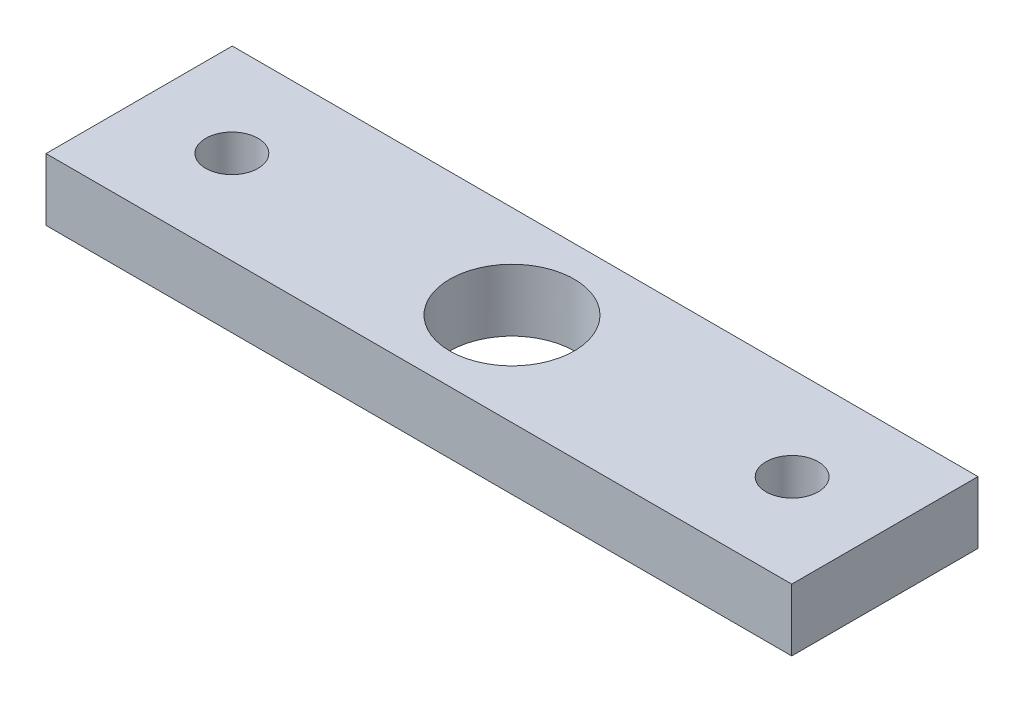
ISO-10303-21;
HEADER;
FILE_DESCRIPTION(('STEP AP214'),'2;1');
FILE_NAME('part.step','',(''),(''),'','','');
FILE_SCHEMA(('AUTOMOTIVE_DESIGN { 1 0 10303 214 1 1 1 1 }'));
ENDSEC;
DATA;
#1=APPLICATION_CONTEXT('core data for automotive mechanical design processes');
#2=APPLICATION_PROTOCOL_DEFINITION('international standard','automotive_design',2000,#1);
#3=PRODUCT_CONTEXT('',#1,'mechanical');
#4=PRODUCT('Part','Part','',(#3));
#5=PRODUCT_RELATED_PRODUCT_CATEGORY('part','',(#4));
#6=PRODUCT_DEFINITION_FORMATION('','',#4);
#7=PRODUCT_DEFINITION_CONTEXT('part definition',#1,'design');
#8=PRODUCT_DEFINITION('design','',#6,#7);
#9=PRODUCT_DEFINITION_SHAPE('','',#8);
#10=(LENGTH_UNIT() NAMED_UNIT(*) SI_UNIT(.MILLI.,.METRE.));
#11=(NAMED_UNIT(*) PLANE_ANGLE_UNIT() SI_UNIT($,.RADIAN.));
#12=(NAMED_UNIT(*) SI_UNIT($,.STERADIAN.) SOLID_ANGLE_UNIT());
#13=UNCERTAINTY_MEASURE_WITH_UNIT(LENGTH_MEASURE(1.E-05),#10,'distance_accuracy_value','');
#14=(GEOMETRIC_REPRESENTATION_CONTEXT(3) GLOBAL_UNCERTAINTY_ASSIGNED_CONTEXT((#13)) GLOBAL_UNIT_ASSIGNED_CONTEXT((#10,
#11,#12)) REPRESENTATION_CONTEXT('',''));
#15=CARTESIAN_POINT('',(0.,0.,0.));
#16=DIRECTION('',(0.,0.,1.));
#17=DIRECTION('',(1.,0.,0.));
#18=AXIS2_PLACEMENT_3D('',#15,#16,#17);
#19=CARTESIAN_POINT('',(38.0365,6.35,9.49999999999999));
#20=DIRECTION('',(-1.,0.,0.));
#21=DIRECTION('',(0.,0.,1.));
#22=AXIS2_PLACEMENT_3D('',#19,#20,#21);
#23=PLANE('',#22);
#24=DIRECTION('',(0.,0.,-1.));
#25=VECTOR('',#24,1.);
#26=CARTESIAN_POINT('',(38.0365,0.,9.49999999999999));
#27=LINE('',#26,#25);
#28=CARTESIAN_POINT('',(38.0365,0.,9.49999999999999));
#29=VERTEX_POINT('',#28);
#30=CARTESIAN_POINT('',(38.0365,0.,-9.50000000000001));
#31=VERTEX_POINT('',#30);
#32=EDGE_CURVE('E95',#29,#31,#27,.T.);
#33=ORIENTED_EDGE('',*,*,#32,.T.);
#34=DIRECTION('',(0.,-1.,0.));
#35=VECTOR('',#34,1.);
#36=CARTESIAN_POINT('',(38.0365,6.35,-9.50000000000001));
#37=LINE('',#36,#35);
#38=CARTESIAN_POINT('',(38.0365,6.35,-9.50000000000001));
#39=VERTEX_POINT('',#38);
#40=EDGE_CURVE('E11',#39,#31,#37,.T.);
#41=ORIENTED_EDGE('',*,*,#40,.F.);
#42=DIRECTION('',(0.,0.,-1.));
#43=VECTOR('',#42,1.);
#44=CARTESIAN_POINT('',(38.0365,6.35,9.49999999999999));
#45=LINE('',#44,#43);
#46=CARTESIAN_POINT('',(38.0365,6.35,9.49999999999999));
#47=VERTEX_POINT('',#46);
#48=EDGE_CURVE('E83',#47,#39,#45,.T.);
#49=ORIENTED_EDGE('',*,*,#48,.F.);
#50=DIRECTION('',(0.,-1.,0.));
#51=VECTOR('',#50,1.);
#52=CARTESIAN_POINT('',(38.0365,6.35,9.49999999999999));
#53=LINE('',#52,#51);
#54=EDGE_CURVE('E91',#47,#29,#53,.T.);
#55=ORIENTED_EDGE('',*,*,#54,.T.);
#56=EDGE_LOOP('',(#33,#41,#49,#55));
#57=FACE_BOUND('',#56,.T.);
#58=ADVANCED_FACE('F32',(#57),#23,.F.);
#59=CARTESIAN_POINT('',(-38.0365,6.35,-9.50000000000001));
#60=DIRECTION('',(0.,0.,1.));
#61=DIRECTION('',(1.,0.,0.));
#62=AXIS2_PLACEMENT_3D('',#59,#60,#61);
#63=PLANE('',#62);
#64=DIRECTION('',(-1.,0.,0.));
#65=VECTOR('',#64,1.);
#66=CARTESIAN_POINT('',(-38.0365,0.,-9.50000000000001));
#67=LINE('',#66,#65);
#68=CARTESIAN_POINT('',(-38.0365,0.,-9.50000000000001));
#69=VERTEX_POINT('',#68);
#70=EDGE_CURVE('E87',#31,#69,#67,.T.);
#71=ORIENTED_EDGE('',*,*,#70,.T.);
#72=DIRECTION('',(0.,-1.,0.));
#73=VECTOR('',#72,1.);
#74=CARTESIAN_POINT('',(-38.0365,6.35,-9.50000000000001));
#75=LINE('',#74,#73);
#76=CARTESIAN_POINT('',(-38.0365,6.35,-9.50000000000001));
#77=VERTEX_POINT('',#76);
#78=EDGE_CURVE('E40',#77,#69,#75,.T.);
#79=ORIENTED_EDGE('',*,*,#78,.F.);
#80=DIRECTION('',(-1.,0.,0.));
#81=VECTOR('',#80,1.);
#82=CARTESIAN_POINT('',(-38.0365,6.35,-9.50000000000001));
#83=LINE('',#82,#81);
#84=EDGE_CURVE('E78',#39,#77,#83,.T.);
#85=ORIENTED_EDGE('',*,*,#84,.F.);
#86=ORIENTED_EDGE('',*,*,#40,.T.);
#87=EDGE_LOOP('',(#71,#79,#85,#86));
#88=FACE_BOUND('',#87,.T.);
#89=ADVANCED_FACE('F86',(#88),#63,.F.);
#90=CARTESIAN_POINT('',(-38.0365,6.35,9.49999999999999));
#91=DIRECTION('',(1.,0.,0.));
#92=DIRECTION('',(0.,0.,-1.));
#93=AXIS2_PLACEMENT_3D('',#90,#91,#92);
#94=PLANE('',#93);
#95=DIRECTION('',(0.,0.,1.));
#96=VECTOR('',#95,1.);
#97=CARTESIAN_POINT('',(-38.0365,0.,9.49999999999999));
#98=LINE('',#97,#96);
#99=CARTESIAN_POINT('',(-38.0365,0.,9.49999999999999));
#100=VERTEX_POINT('',#99);
#101=EDGE_CURVE('E65',#69,#100,#98,.T.);
#102=ORIENTED_EDGE('',*,*,#101,.T.);
#103=DIRECTION('',(0.,-1.,0.));
#104=VECTOR('',#103,1.);
#105=CARTESIAN_POINT('',(-38.0365,6.35,9.49999999999999));
#106=LINE('',#105,#104);
#107=CARTESIAN_POINT('',(-38.0365,6.35,9.49999999999999));
#108=VERTEX_POINT('',#107);
#109=EDGE_CURVE('E88',#108,#100,#106,.T.);
#110=ORIENTED_EDGE('',*,*,#109,.F.);
#111=DIRECTION('',(0.,0.,1.));
#112=VECTOR('',#111,1.);
#113=CARTESIAN_POINT('',(-38.0365,6.35,9.49999999999999));
#114=LINE('',#113,#112);
#115=EDGE_CURVE('E81',#77,#108,#114,.T.);
#116=ORIENTED_EDGE('',*,*,#115,.F.);
#117=ORIENTED_EDGE('',*,*,#78,.T.);
#118=EDGE_LOOP('',(#102,#110,#116,#117));
#119=FACE_BOUND('',#118,.T.);
#120=ADVANCED_FACE('F89',(#119),#94,.F.);
#121=CARTESIAN_POINT('',(-38.0365,6.35,9.49999999999999));
#122=DIRECTION('',(0.,0.,-1.));
#123=DIRECTION('',(-1.,0.,0.));
#124=AXIS2_PLACEMENT_3D('',#121,#122,#123);
#125=PLANE('',#124);
#126=DIRECTION('',(1.,0.,0.));
#127=VECTOR('',#126,1.);
#128=CARTESIAN_POINT('',(-38.0365,0.,9.49999999999999));
#129=LINE('',#128,#127);
#130=EDGE_CURVE('E71',#100,#29,#129,.T.);
#131=ORIENTED_EDGE('',*,*,#130,.T.);
#132=ORIENTED_EDGE('',*,*,#54,.F.);
#133=DIRECTION('',(1.,0.,0.));
#134=VECTOR('',#133,1.);
#135=CARTESIAN_POINT('',(-38.0365,6.35,9.49999999999999));
#136=LINE('',#135,#134);
#137=EDGE_CURVE('E48',#108,#47,#136,.T.);
#138=ORIENTED_EDGE('',*,*,#137,.F.);
#139=ORIENTED_EDGE('',*,*,#109,.T.);
#140=EDGE_LOOP('',(#131,#132,#138,#139));
#141=FACE_BOUND('',#140,.T.);
#142=ADVANCED_FACE('F103',(#141),#125,.F.);
#143=CARTESIAN_POINT('',(0.,6.35,0.));
#144=DIRECTION('',(0.,-1.,0.));
#145=DIRECTION('',(0.,0.,-1.));
#146=AXIS2_PLACEMENT_3D('',#143,#144,#145);
#147=PLANE('',#146);
#148=CARTESIAN_POINT('',(28.575,6.35,0.));
#149=DIRECTION('',(0.,1.,0.));
#150=DIRECTION('',(0.,0.,1.));
#151=AXIS2_PLACEMENT_3D('',#148,#149,#150);
#152=CIRCLE('',#151,2.665);
#153=CARTESIAN_POINT('',(28.575,6.35,2.665));
#154=VERTEX_POINT('',#153);
#155=EDGE_CURVE('E112',#154,#154,#152,.T.);
#156=ORIENTED_EDGE('',*,*,#155,.F.);
#157=EDGE_LOOP('',(#156));
#158=FACE_BOUND('',#157,.T.);
#159=CARTESIAN_POINT('',(-28.5750000000001,6.35,0.));
#160=DIRECTION('',(0.,1.,0.));
#161=DIRECTION('',(0.,0.,-1.));
#162=AXIS2_PLACEMENT_3D('',#159,#160,#161);
#163=CIRCLE('',#162,2.665);
#164=CARTESIAN_POINT('',(-28.5750000000001,6.35,-2.665));
#165=VERTEX_POINT('',#164);
#166=EDGE_CURVE('E118',#165,#165,#163,.T.);
#167=ORIENTED_EDGE('',*,*,#166,.F.);
#168=EDGE_LOOP('',(#167));
#169=FACE_BOUND('',#168,.T.);
#170=CARTESIAN_POINT('',(0.,6.35,0.));
#171=DIRECTION('',(0.,1.,0.));
#172=DIRECTION('',(0.,0.,1.));
#173=AXIS2_PLACEMENT_3D('',#170,#171,#172);
#174=CIRCLE('',#173,6.35);
#175=CARTESIAN_POINT('',(0.,6.35,6.35));
#176=VERTEX_POINT('',#175);
#177=EDGE_CURVE('E98',#176,#176,#174,.T.);
#178=ORIENTED_EDGE('',*,*,#177,.F.);
#179=EDGE_LOOP('',(#178));
#180=FACE_BOUND('',#179,.T.);
#181=ORIENTED_EDGE('',*,*,#48,.T.);
#182=ORIENTED_EDGE('',*,*,#84,.T.);
#183=ORIENTED_EDGE('',*,*,#115,.T.);
#184=ORIENTED_EDGE('',*,*,#137,.T.);
#185=EDGE_LOOP('',(#181,#182,#183,#184));
#186=FACE_BOUND('',#185,.T.);
#187=ADVANCED_FACE('F79',(#158,#169,#180,#186),#147,.F.);
#188=CARTESIAN_POINT('',(0.,0.,0.));
#189=DIRECTION('',(0.,-1.,0.));
#190=DIRECTION('',(0.,0.,-1.));
#191=AXIS2_PLACEMENT_3D('',#188,#189,#190);
#192=PLANE('',#191);
#193=CARTESIAN_POINT('',(28.575,0.,0.));
#194=DIRECTION('',(0.,-1.,0.));
#195=DIRECTION('',(0.,0.,-1.));
#196=AXIS2_PLACEMENT_3D('',#193,#194,#195);
#197=CIRCLE('',#196,2.665);
#198=CARTESIAN_POINT('',(28.575,0.,-2.665));
#199=VERTEX_POINT('',#198);
#200=EDGE_CURVE('E121',#199,#199,#197,.F.);
#201=ORIENTED_EDGE('',*,*,#200,.T.);
#202=EDGE_LOOP('',(#201));
#203=FACE_BOUND('',#202,.T.);
#204=CARTESIAN_POINT('',(-28.5750000000001,0.,0.));
#205=DIRECTION('',(0.,-1.,0.));
#206=DIRECTION('',(0.,0.,-1.));
#207=AXIS2_PLACEMENT_3D('',#204,#205,#206);
#208=CIRCLE('',#207,2.665);
#209=CARTESIAN_POINT('',(-28.5750000000001,0.,-2.665));
#210=VERTEX_POINT('',#209);
#211=EDGE_CURVE('E115',#210,#210,#208,.F.);
#212=ORIENTED_EDGE('',*,*,#211,.T.);
#213=EDGE_LOOP('',(#212));
#214=FACE_BOUND('',#213,.T.);
#215=CARTESIAN_POINT('',(0.,0.,0.));
#216=DIRECTION('',(0.,-1.,0.));
#217=DIRECTION('',(0.,0.,-1.));
#218=AXIS2_PLACEMENT_3D('',#215,#216,#217);
#219=CIRCLE('',#218,6.35);
#220=CARTESIAN_POINT('',(0.,0.,-6.35));
#221=VERTEX_POINT('',#220);
#222=EDGE_CURVE('E109',#221,#221,#219,.F.);
#223=ORIENTED_EDGE('',*,*,#222,.T.);
#224=EDGE_LOOP('',(#223));
#225=FACE_BOUND('',#224,.T.);
#226=ORIENTED_EDGE('',*,*,#32,.F.);
#227=ORIENTED_EDGE('',*,*,#130,.F.);
#228=ORIENTED_EDGE('',*,*,#101,.F.);
#229=ORIENTED_EDGE('',*,*,#70,.F.);
#230=EDGE_LOOP('',(#226,#227,#228,#229));
#231=FACE_BOUND('',#230,.T.);
#232=ADVANCED_FACE('F106',(#203,#214,#225,#231),#192,.T.);
#233=CARTESIAN_POINT('',(0.,-0.00100000000000013,0.));
#234=DIRECTION('',(0.,1.,0.));
#235=DIRECTION('',(0.,0.,1.));
#236=AXIS2_PLACEMENT_3D('',#233,#234,#235);
#237=CYLINDRICAL_SURFACE('',#236,6.35);
#238=ORIENTED_EDGE('',*,*,#222,.F.);
#239=EDGE_LOOP('',(#238));
#240=FACE_BOUND('',#239,.T.);
#241=ORIENTED_EDGE('',*,*,#177,.T.);
#242=EDGE_LOOP('',(#241));
#243=FACE_BOUND('',#242,.T.);
#244=ADVANCED_FACE('F136',(#240,#243),#237,.F.);
#245=CARTESIAN_POINT('',(-28.5750000000001,-0.00100000000000013,0.));
#246=DIRECTION('',(0.,1.,0.));
#247=DIRECTION('',(0.,0.,1.));
#248=AXIS2_PLACEMENT_3D('',#245,#246,#247);
#249=CYLINDRICAL_SURFACE('',#248,2.665);
#250=ORIENTED_EDGE('',*,*,#211,.F.);
#251=EDGE_LOOP('',(#250));
#252=FACE_BOUND('',#251,.T.);
#253=ORIENTED_EDGE('',*,*,#166,.T.);
#254=EDGE_LOOP('',(#253));
#255=FACE_BOUND('',#254,.T.);
#256=ADVANCED_FACE('F138',(#252,#255),#249,.F.);
#257=CARTESIAN_POINT('',(28.575,-0.00100000000000013,0.));
#258=DIRECTION('',(0.,1.,0.));
#259=DIRECTION('',(0.,0.,1.));
#260=AXIS2_PLACEMENT_3D('',#257,#258,#259);
#261=CYLINDRICAL_SURFACE('',#260,2.665);
#262=ORIENTED_EDGE('',*,*,#200,.F.);
#263=EDGE_LOOP('',(#262));
#264=FACE_BOUND('',#263,.T.);
#265=ORIENTED_EDGE('',*,*,#155,.T.);
#266=EDGE_LOOP('',(#265));
#267=FACE_BOUND('',#266,.T.);
#268=ADVANCED_FACE('F127',(#264,#267),#261,.F.);
#269=CLOSED_SHELL('',(#58,#89,#120,#142,#187,#232,#244,#256,#268));
#270=MANIFOLD_SOLID_BREP('B2',#269);
#271=ADVANCED_BREP_SHAPE_REPRESENTATION('',(#18,#270),#14);
#272=SHAPE_DEFINITION_REPRESENTATION(#9,#271);
ENDSEC;
END-ISO-10303-21;
